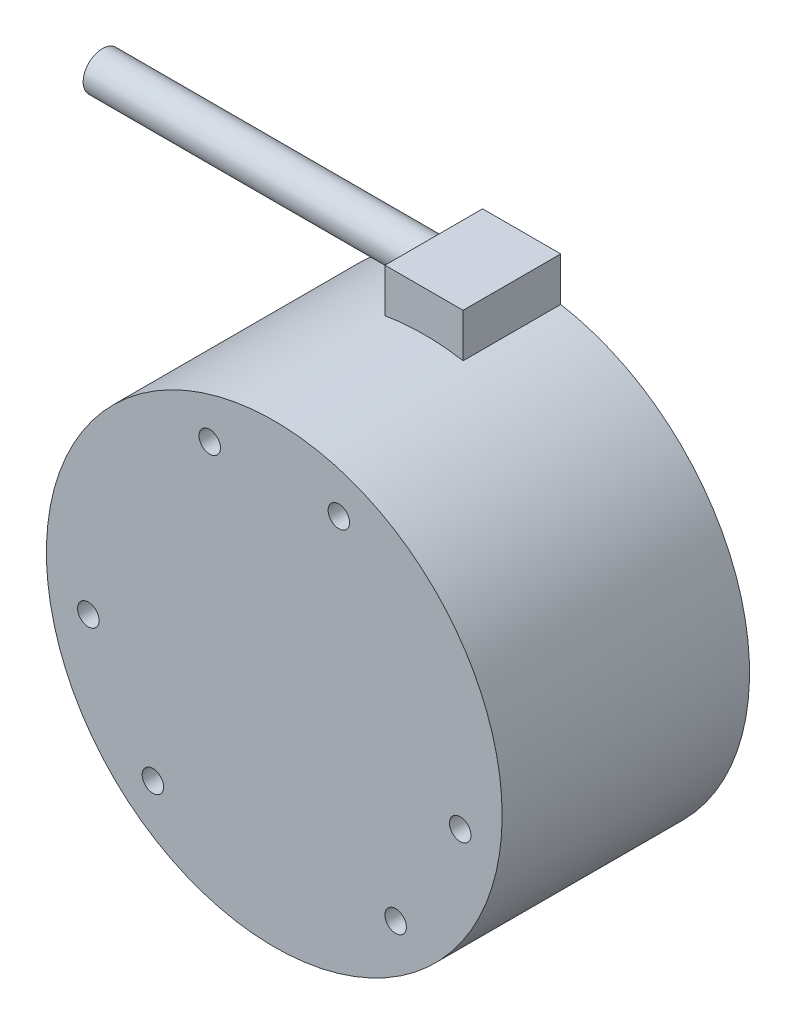
ISO-10303-21;
HEADER;
FILE_DESCRIPTION(('STEP AP214'),'2;1');
FILE_NAME('part.step','',(''),(''),'','','');
FILE_SCHEMA(('AUTOMOTIVE_DESIGN { 1 0 10303 214 1 1 1 1 }'));
ENDSEC;
DATA;
#1=APPLICATION_CONTEXT('core data for automotive mechanical design processes');
#2=APPLICATION_PROTOCOL_DEFINITION('international standard','automotive_design',2000,#1);
#3=PRODUCT_CONTEXT('',#1,'mechanical');
#4=PRODUCT('Part','Part','',(#3));
#5=PRODUCT_RELATED_PRODUCT_CATEGORY('part','',(#4));
#6=PRODUCT_DEFINITION_FORMATION('','',#4);
#7=PRODUCT_DEFINITION_CONTEXT('part definition',#1,'design');
#8=PRODUCT_DEFINITION('design','',#6,#7);
#9=PRODUCT_DEFINITION_SHAPE('','',#8);
#10=(LENGTH_UNIT() NAMED_UNIT(*) SI_UNIT(.MILLI.,.METRE.));
#11=(NAMED_UNIT(*) PLANE_ANGLE_UNIT() SI_UNIT($,.RADIAN.));
#12=(NAMED_UNIT(*) SI_UNIT($,.STERADIAN.) SOLID_ANGLE_UNIT());
#13=UNCERTAINTY_MEASURE_WITH_UNIT(LENGTH_MEASURE(1.E-05),#10,'distance_accuracy_value','');
#14=(GEOMETRIC_REPRESENTATION_CONTEXT(3) GLOBAL_UNCERTAINTY_ASSIGNED_CONTEXT((#13)) GLOBAL_UNIT_ASSIGNED_CONTEXT((#10,
#11,#12)) REPRESENTATION_CONTEXT('',''));
#15=CARTESIAN_POINT('',(0.,0.,0.));
#16=DIRECTION('',(0.,0.,1.));
#17=DIRECTION('',(1.,0.,0.));
#18=AXIS2_PLACEMENT_3D('',#15,#16,#17);
#19=CARTESIAN_POINT('',(0.,0.,38.));
#20=DIRECTION('',(0.,0.,-1.));
#21=DIRECTION('',(-1.,0.,0.));
#22=AXIS2_PLACEMENT_3D('',#19,#20,#21);
#23=CYLINDRICAL_SURFACE('',#22,35.);
#24=CARTESIAN_POINT('',(0.,0.,38.));
#25=DIRECTION('',(0.,0.,1.));
#26=DIRECTION('',(1.,0.,0.));
#27=AXIS2_PLACEMENT_3D('',#24,#25,#26);
#28=CIRCLE('',#27,35.);
#29=CARTESIAN_POINT('',(35.,0.,38.));
#30=VERTEX_POINT('',#29);
#31=EDGE_CURVE('E162',#30,#30,#28,.T.);
#32=ORIENTED_EDGE('',*,*,#31,.F.);
#33=EDGE_LOOP('',(#32));
#34=FACE_BOUND('',#33,.T.);
#35=CARTESIAN_POINT('',(0.,0.,15.));
#36=DIRECTION('',(0.,0.,1.));
#37=DIRECTION('',(1.,0.,0.));
#38=AXIS2_PLACEMENT_3D('',#35,#36,#37);
#39=CIRCLE('',#38,35.);
#40=CARTESIAN_POINT('',(6.,34.4818792991333,15.));
#41=VERTEX_POINT('',#40);
#42=CARTESIAN_POINT('',(-6.,34.4818792991333,15.));
#43=VERTEX_POINT('',#42);
#44=EDGE_CURVE('E36',#41,#43,#39,.T.);
#45=ORIENTED_EDGE('',*,*,#44,.T.);
#46=DIRECTION('',(0.,0.,-1.));
#47=VECTOR('',#46,1.);
#48=CARTESIAN_POINT('',(-6.,34.4818792991333,38.));
#49=LINE('',#48,#47);
#50=CARTESIAN_POINT('',(-6.,34.4818792991333,0.));
#51=VERTEX_POINT('',#50);
#52=EDGE_CURVE('E159',#43,#51,#49,.T.);
#53=ORIENTED_EDGE('',*,*,#52,.T.);
#54=CARTESIAN_POINT('',(0.,0.,0.));
#55=DIRECTION('',(0.,0.,1.));
#56=DIRECTION('',(1.,0.,0.));
#57=AXIS2_PLACEMENT_3D('',#54,#55,#56);
#58=CIRCLE('',#57,35.);
#59=CARTESIAN_POINT('',(6.,34.4818792991333,0.));
#60=VERTEX_POINT('',#59);
#61=EDGE_CURVE('E161',#51,#60,#58,.T.);
#62=ORIENTED_EDGE('',*,*,#61,.T.);
#63=DIRECTION('',(0.,0.,-1.));
#64=VECTOR('',#63,1.);
#65=CARTESIAN_POINT('',(6.,34.4818792991333,38.));
#66=LINE('',#65,#64);
#67=EDGE_CURVE('E151',#60,#41,#66,.F.);
#68=ORIENTED_EDGE('',*,*,#67,.T.);
#69=EDGE_LOOP('',(#45,#53,#62,#68));
#70=FACE_BOUND('',#69,.T.);
#71=ADVANCED_FACE('F33',(#34,#70),#23,.T.);
#72=CARTESIAN_POINT('',(0.,0.,38.));
#73=DIRECTION('',(0.,0.,1.));
#74=DIRECTION('',(1.,0.,0.));
#75=AXIS2_PLACEMENT_3D('',#72,#73,#74);
#76=PLANE('',#75);
#77=CARTESIAN_POINT('',(-9.91858415644441,27.2510860027913,38.));
#78=DIRECTION('',(0.,0.,1.));
#79=DIRECTION('',(1.,0.,0.));
#80=AXIS2_PLACEMENT_3D('',#77,#78,#79);
#81=CIRCLE('',#80,1.65);
#82=CARTESIAN_POINT('',(-8.26858415644442,27.2510860027913,38.));
#83=VERTEX_POINT('',#82);
#84=EDGE_CURVE('E101',#83,#83,#81,.T.);
#85=ORIENTED_EDGE('',*,*,#84,.F.);
#86=EDGE_LOOP('',(#85));
#87=FACE_BOUND('',#86,.T.);
#88=CARTESIAN_POINT('',(9.91858415644442,27.2510860027913,38.));
#89=DIRECTION('',(0.,0.,1.));
#90=DIRECTION('',(1.,0.,0.));
#91=AXIS2_PLACEMENT_3D('',#88,#89,#90);
#92=CIRCLE('',#91,1.65);
#93=CARTESIAN_POINT('',(11.5685841564444,27.2510860027913,38.));
#94=VERTEX_POINT('',#93);
#95=EDGE_CURVE('E100',#94,#94,#92,.T.);
#96=ORIENTED_EDGE('',*,*,#95,.F.);
#97=EDGE_LOOP('',(#96));
#98=FACE_BOUND('',#97,.T.);
#99=CARTESIAN_POINT('',(28.5594248373575,-5.03579715234037,38.));
#100=DIRECTION('',(0.,0.,1.));
#101=DIRECTION('',(1.,0.,0.));
#102=AXIS2_PLACEMENT_3D('',#99,#100,#101);
#103=CIRCLE('',#102,1.65);
#104=CARTESIAN_POINT('',(30.2094248373575,-5.03579715234037,38.));
#105=VERTEX_POINT('',#104);
#106=EDGE_CURVE('E111',#105,#105,#103,.T.);
#107=ORIENTED_EDGE('',*,*,#106,.F.);
#108=EDGE_LOOP('',(#107));
#109=FACE_BOUND('',#108,.T.);
#110=CARTESIAN_POINT('',(18.6408406809131,-22.2152888504498,38.));
#111=DIRECTION('',(0.,0.,1.));
#112=DIRECTION('',(1.,0.,0.));
#113=AXIS2_PLACEMENT_3D('',#110,#111,#112);
#114=CIRCLE('',#113,1.65);
#115=CARTESIAN_POINT('',(20.2908406809131,-22.2152888504498,38.));
#116=VERTEX_POINT('',#115);
#117=EDGE_CURVE('E117',#116,#116,#114,.T.);
#118=ORIENTED_EDGE('',*,*,#117,.F.);
#119=EDGE_LOOP('',(#118));
#120=FACE_BOUND('',#119,.T.);
#121=CARTESIAN_POINT('',(-18.6408406809074,-22.2152888504531,38.));
#122=DIRECTION('',(0.,0.,1.));
#123=DIRECTION('',(1.,0.,0.));
#124=AXIS2_PLACEMENT_3D('',#121,#122,#123);
#125=CIRCLE('',#124,1.65);
#126=CARTESIAN_POINT('',(-16.9908406809074,-22.2152888504531,38.));
#127=VERTEX_POINT('',#126);
#128=EDGE_CURVE('E123',#127,#127,#125,.T.);
#129=ORIENTED_EDGE('',*,*,#128,.F.);
#130=EDGE_LOOP('',(#129));
#131=FACE_BOUND('',#130,.T.);
#132=CARTESIAN_POINT('',(-28.5594248373518,-5.03579715234368,38.));
#133=DIRECTION('',(0.,0.,1.));
#134=DIRECTION('',(1.,0.,0.));
#135=AXIS2_PLACEMENT_3D('',#132,#133,#134);
#136=CIRCLE('',#135,1.65);
#137=CARTESIAN_POINT('',(-26.9094248373518,-5.03579715234368,38.));
#138=VERTEX_POINT('',#137);
#139=EDGE_CURVE('E129',#138,#138,#136,.T.);
#140=ORIENTED_EDGE('',*,*,#139,.F.);
#141=EDGE_LOOP('',(#140));
#142=FACE_BOUND('',#141,.T.);
#143=ORIENTED_EDGE('',*,*,#31,.T.);
#144=EDGE_LOOP('',(#143));
#145=FACE_BOUND('',#144,.T.);
#146=ADVANCED_FACE('F191',(#87,#98,#109,#120,#131,#142,#145),#76,.T.);
#147=CARTESIAN_POINT('',(0.,0.,0.));
#148=DIRECTION('',(0.,0.,1.));
#149=DIRECTION('',(1.,0.,0.));
#150=AXIS2_PLACEMENT_3D('',#147,#148,#149);
#151=PLANE('',#150);
#152=ORIENTED_EDGE('',*,*,#61,.F.);
#153=DIRECTION('',(0.,1.,0.));
#154=VECTOR('',#153,1.);
#155=CARTESIAN_POINT('',(-6.,30.2,0.));
#156=LINE('',#155,#154);
#157=CARTESIAN_POINT('',(-6.,41.2,0.));
#158=VERTEX_POINT('',#157);
#159=EDGE_CURVE('E55',#51,#158,#156,.T.);
#160=ORIENTED_EDGE('',*,*,#159,.T.);
#161=DIRECTION('',(-1.,0.,0.));
#162=VECTOR('',#161,1.);
#163=CARTESIAN_POINT('',(-6.,41.2,0.));
#164=LINE('',#163,#162);
#165=CARTESIAN_POINT('',(6.,41.2,0.));
#166=VERTEX_POINT('',#165);
#167=EDGE_CURVE('E147',#166,#158,#164,.T.);
#168=ORIENTED_EDGE('',*,*,#167,.F.);
#169=DIRECTION('',(0.,1.,0.));
#170=VECTOR('',#169,1.);
#171=CARTESIAN_POINT('',(6.,30.2,0.));
#172=LINE('',#171,#170);
#173=EDGE_CURVE('E152',#60,#166,#172,.T.);
#174=ORIENTED_EDGE('',*,*,#173,.F.);
#175=EDGE_LOOP('',(#152,#160,#168,#174));
#176=FACE_BOUND('',#175,.T.);
#177=ADVANCED_FACE('F170',(#176),#151,.F.);
#178=CARTESIAN_POINT('',(-6.,30.2,0.));
#179=DIRECTION('',(-1.,0.,0.));
#180=DIRECTION('',(0.,0.,1.));
#181=AXIS2_PLACEMENT_3D('',#178,#179,#180);
#182=PLANE('',#181);
#183=CARTESIAN_POINT('',(-6.,37.7608934756785,7.40588586129198));
#184=DIRECTION('',(-1.,0.,0.));
#185=DIRECTION('',(0.,0.,1.));
#186=AXIS2_PLACEMENT_3D('',#183,#184,#185);
#187=CIRCLE('',#186,2.95);
#188=CARTESIAN_POINT('',(-6.,37.7608934756785,10.355885861292));
#189=VERTEX_POINT('',#188);
#190=EDGE_CURVE('E11',#189,#189,#187,.T.);
#191=ORIENTED_EDGE('',*,*,#190,.F.);
#192=EDGE_LOOP('',(#191));
#193=FACE_BOUND('',#192,.T.);
#194=ORIENTED_EDGE('',*,*,#52,.F.);
#195=DIRECTION('',(0.,1.,0.));
#196=VECTOR('',#195,1.);
#197=CARTESIAN_POINT('',(-6.,30.2,15.));
#198=LINE('',#197,#196);
#199=CARTESIAN_POINT('',(-6.,41.2,15.));
#200=VERTEX_POINT('',#199);
#201=EDGE_CURVE('E48',#43,#200,#198,.T.);
#202=ORIENTED_EDGE('',*,*,#201,.T.);
#203=DIRECTION('',(0.,0.,1.));
#204=VECTOR('',#203,1.);
#205=CARTESIAN_POINT('',(-6.,41.2,0.));
#206=LINE('',#205,#204);
#207=EDGE_CURVE('E137',#158,#200,#206,.T.);
#208=ORIENTED_EDGE('',*,*,#207,.F.);
#209=ORIENTED_EDGE('',*,*,#159,.F.);
#210=EDGE_LOOP('',(#194,#202,#208,#209));
#211=FACE_BOUND('',#210,.T.);
#212=ADVANCED_FACE('F187',(#193,#211),#182,.T.);
#213=CARTESIAN_POINT('',(6.,30.2,0.));
#214=DIRECTION('',(1.,0.,0.));
#215=DIRECTION('',(0.,0.,-1.));
#216=AXIS2_PLACEMENT_3D('',#213,#214,#215);
#217=PLANE('',#216);
#218=ORIENTED_EDGE('',*,*,#67,.F.);
#219=ORIENTED_EDGE('',*,*,#173,.T.);
#220=DIRECTION('',(0.,0.,-1.));
#221=VECTOR('',#220,1.);
#222=CARTESIAN_POINT('',(6.,41.2,0.));
#223=LINE('',#222,#221);
#224=CARTESIAN_POINT('',(6.,41.2,15.));
#225=VERTEX_POINT('',#224);
#226=EDGE_CURVE('E144',#225,#166,#223,.T.);
#227=ORIENTED_EDGE('',*,*,#226,.F.);
#228=DIRECTION('',(0.,1.,0.));
#229=VECTOR('',#228,1.);
#230=CARTESIAN_POINT('',(6.,30.2,15.));
#231=LINE('',#230,#229);
#232=EDGE_CURVE('E154',#41,#225,#231,.T.);
#233=ORIENTED_EDGE('',*,*,#232,.F.);
#234=EDGE_LOOP('',(#218,#219,#227,#233));
#235=FACE_BOUND('',#234,.T.);
#236=ADVANCED_FACE('F174',(#235),#217,.T.);
#237=CARTESIAN_POINT('',(-6.,30.2,15.));
#238=DIRECTION('',(0.,0.,1.));
#239=DIRECTION('',(1.,0.,0.));
#240=AXIS2_PLACEMENT_3D('',#237,#238,#239);
#241=PLANE('',#240);
#242=ORIENTED_EDGE('',*,*,#44,.F.);
#243=ORIENTED_EDGE('',*,*,#232,.T.);
#244=DIRECTION('',(1.,0.,0.));
#245=VECTOR('',#244,1.);
#246=CARTESIAN_POINT('',(-6.,41.2,15.));
#247=LINE('',#246,#245);
#248=EDGE_CURVE('E141',#200,#225,#247,.T.);
#249=ORIENTED_EDGE('',*,*,#248,.F.);
#250=ORIENTED_EDGE('',*,*,#201,.F.);
#251=EDGE_LOOP('',(#242,#243,#249,#250));
#252=FACE_BOUND('',#251,.T.);
#253=ADVANCED_FACE('F178',(#252),#241,.T.);
#254=CARTESIAN_POINT('',(0.,41.2,0.));
#255=DIRECTION('',(0.,1.,0.));
#256=DIRECTION('',(0.,0.,1.));
#257=AXIS2_PLACEMENT_3D('',#254,#255,#256);
#258=PLANE('',#257);
#259=ORIENTED_EDGE('',*,*,#207,.T.);
#260=ORIENTED_EDGE('',*,*,#248,.T.);
#261=ORIENTED_EDGE('',*,*,#226,.T.);
#262=ORIENTED_EDGE('',*,*,#167,.T.);
#263=EDGE_LOOP('',(#259,#260,#261,#262));
#264=FACE_BOUND('',#263,.T.);
#265=ADVANCED_FACE('F177',(#264),#258,.T.);
#266=CARTESIAN_POINT('',(-57.,37.7608934756785,7.40588586129199));
#267=DIRECTION('',(1.,0.,0.));
#268=DIRECTION('',(0.,0.,-1.));
#269=AXIS2_PLACEMENT_3D('',#266,#267,#268);
#270=CYLINDRICAL_SURFACE('',#269,2.95);
#271=ORIENTED_EDGE('',*,*,#190,.T.);
#272=EDGE_LOOP('',(#271));
#273=FACE_BOUND('',#272,.T.);
#274=CARTESIAN_POINT('',(-57.,37.7608934756785,7.40588586129199));
#275=DIRECTION('',(1.,0.,0.));
#276=DIRECTION('',(0.,0.,-1.));
#277=AXIS2_PLACEMENT_3D('',#274,#275,#276);
#278=CIRCLE('',#277,2.95);
#279=CARTESIAN_POINT('',(-57.,37.7608934756785,4.45588586129199));
#280=VERTEX_POINT('',#279);
#281=EDGE_CURVE('E135',#280,#280,#278,.T.);
#282=ORIENTED_EDGE('',*,*,#281,.T.);
#283=EDGE_LOOP('',(#282));
#284=FACE_BOUND('',#283,.T.);
#285=ADVANCED_FACE('F185',(#273,#284),#270,.T.);
#286=CARTESIAN_POINT('',(-57.,37.7608934756785,7.40588586129199));
#287=DIRECTION('',(1.,0.,0.));
#288=DIRECTION('',(0.,0.,-1.));
#289=AXIS2_PLACEMENT_3D('',#286,#287,#288);
#290=PLANE('',#289);
#291=ORIENTED_EDGE('',*,*,#281,.F.);
#292=EDGE_LOOP('',(#291));
#293=FACE_BOUND('',#292,.T.);
#294=ADVANCED_FACE('F213',(#293),#290,.F.);
#295=CARTESIAN_POINT('',(-28.5594248373518,-5.03579715234368,33.));
#296=DIRECTION('',(0.,0.,1.));
#297=DIRECTION('',(1.,0.,0.));
#298=AXIS2_PLACEMENT_3D('',#295,#296,#297);
#299=CONICAL_SURFACE('',#298,1.65,1.02974425867665);
#300=CARTESIAN_POINT('',(-28.5594248373518,-5.03579715234368,32.0085799786045));
#301=VERTEX_POINT('',#300);
#302=VERTEX_LOOP('',#301);
#303=FACE_BOUND('',#302,.T.);
#304=CARTESIAN_POINT('',(-28.5594248373518,-5.03579715234368,33.));
#305=DIRECTION('',(0.,0.,1.));
#306=DIRECTION('',(1.,0.,0.));
#307=AXIS2_PLACEMENT_3D('',#304,#305,#306);
#308=CIRCLE('',#307,1.65);
#309=CARTESIAN_POINT('',(-26.9094248373518,-5.03579715234368,33.));
#310=VERTEX_POINT('',#309);
#311=EDGE_CURVE('E132',#310,#310,#308,.T.);
#312=ORIENTED_EDGE('',*,*,#311,.T.);
#313=EDGE_LOOP('',(#312));
#314=FACE_BOUND('',#313,.T.);
#315=ADVANCED_FACE('F218',(#303,#314),#299,.F.);
#316=CARTESIAN_POINT('',(-28.5594248373518,-5.03579715234368,38.));
#317=DIRECTION('',(0.,0.,1.));
#318=DIRECTION('',(1.,0.,0.));
#319=AXIS2_PLACEMENT_3D('',#316,#317,#318);
#320=CYLINDRICAL_SURFACE('',#319,1.65);
#321=ORIENTED_EDGE('',*,*,#311,.F.);
#322=EDGE_LOOP('',(#321));
#323=FACE_BOUND('',#322,.T.);
#324=ORIENTED_EDGE('',*,*,#139,.T.);
#325=EDGE_LOOP('',(#324));
#326=FACE_BOUND('',#325,.T.);
#327=ADVANCED_FACE('F223',(#323,#326),#320,.F.);
#328=CARTESIAN_POINT('',(-18.6408406809074,-22.2152888504531,33.));
#329=DIRECTION('',(0.,0.,1.));
#330=DIRECTION('',(1.,0.,0.));
#331=AXIS2_PLACEMENT_3D('',#328,#329,#330);
#332=CONICAL_SURFACE('',#331,1.65,1.02974425867665);
#333=CARTESIAN_POINT('',(-18.6408406809074,-22.2152888504531,32.0085799786045));
#334=VERTEX_POINT('',#333);
#335=VERTEX_LOOP('',#334);
#336=FACE_BOUND('',#335,.T.);
#337=CARTESIAN_POINT('',(-18.6408406809074,-22.2152888504531,33.));
#338=DIRECTION('',(0.,0.,1.));
#339=DIRECTION('',(1.,0.,0.));
#340=AXIS2_PLACEMENT_3D('',#337,#338,#339);
#341=CIRCLE('',#340,1.65);
#342=CARTESIAN_POINT('',(-16.9908406809074,-22.2152888504531,33.));
#343=VERTEX_POINT('',#342);
#344=EDGE_CURVE('E126',#343,#343,#341,.T.);
#345=ORIENTED_EDGE('',*,*,#344,.T.);
#346=EDGE_LOOP('',(#345));
#347=FACE_BOUND('',#346,.T.);
#348=ADVANCED_FACE('F229',(#336,#347),#332,.F.);
#349=CARTESIAN_POINT('',(-18.6408406809074,-22.2152888504531,38.));
#350=DIRECTION('',(0.,0.,1.));
#351=DIRECTION('',(1.,0.,0.));
#352=AXIS2_PLACEMENT_3D('',#349,#350,#351);
#353=CYLINDRICAL_SURFACE('',#352,1.65);
#354=ORIENTED_EDGE('',*,*,#344,.F.);
#355=EDGE_LOOP('',(#354));
#356=FACE_BOUND('',#355,.T.);
#357=ORIENTED_EDGE('',*,*,#128,.T.);
#358=EDGE_LOOP('',(#357));
#359=FACE_BOUND('',#358,.T.);
#360=ADVANCED_FACE('F233',(#356,#359),#353,.F.);
#361=CARTESIAN_POINT('',(18.6408406809131,-22.2152888504498,33.));
#362=DIRECTION('',(0.,0.,1.));
#363=DIRECTION('',(1.,0.,0.));
#364=AXIS2_PLACEMENT_3D('',#361,#362,#363);
#365=CONICAL_SURFACE('',#364,1.65,1.02974425867665);
#366=CARTESIAN_POINT('',(18.6408406809131,-22.2152888504498,32.0085799786045));
#367=VERTEX_POINT('',#366);
#368=VERTEX_LOOP('',#367);
#369=FACE_BOUND('',#368,.T.);
#370=CARTESIAN_POINT('',(18.6408406809131,-22.2152888504498,33.));
#371=DIRECTION('',(0.,0.,1.));
#372=DIRECTION('',(1.,0.,0.));
#373=AXIS2_PLACEMENT_3D('',#370,#371,#372);
#374=CIRCLE('',#373,1.65);
#375=CARTESIAN_POINT('',(20.2908406809131,-22.2152888504498,33.));
#376=VERTEX_POINT('',#375);
#377=EDGE_CURVE('E120',#376,#376,#374,.T.);
#378=ORIENTED_EDGE('',*,*,#377,.T.);
#379=EDGE_LOOP('',(#378));
#380=FACE_BOUND('',#379,.T.);
#381=ADVANCED_FACE('F237',(#369,#380),#365,.F.);
#382=CARTESIAN_POINT('',(18.6408406809131,-22.2152888504498,38.));
#383=DIRECTION('',(0.,0.,1.));
#384=DIRECTION('',(1.,0.,0.));
#385=AXIS2_PLACEMENT_3D('',#382,#383,#384);
#386=CYLINDRICAL_SURFACE('',#385,1.65);
#387=ORIENTED_EDGE('',*,*,#377,.F.);
#388=EDGE_LOOP('',(#387));
#389=FACE_BOUND('',#388,.T.);
#390=ORIENTED_EDGE('',*,*,#117,.T.);
#391=EDGE_LOOP('',(#390));
#392=FACE_BOUND('',#391,.T.);
#393=ADVANCED_FACE('F241',(#389,#392),#386,.F.);
#394=CARTESIAN_POINT('',(28.5594248373575,-5.03579715234037,33.));
#395=DIRECTION('',(0.,0.,1.));
#396=DIRECTION('',(1.,0.,0.));
#397=AXIS2_PLACEMENT_3D('',#394,#395,#396);
#398=CONICAL_SURFACE('',#397,1.65,1.02974425867665);
#399=CARTESIAN_POINT('',(28.5594248373575,-5.03579715234037,32.0085799786045));
#400=VERTEX_POINT('',#399);
#401=VERTEX_LOOP('',#400);
#402=FACE_BOUND('',#401,.T.);
#403=CARTESIAN_POINT('',(28.5594248373575,-5.03579715234037,33.));
#404=DIRECTION('',(0.,0.,1.));
#405=DIRECTION('',(1.,0.,0.));
#406=AXIS2_PLACEMENT_3D('',#403,#404,#405);
#407=CIRCLE('',#406,1.65);
#408=CARTESIAN_POINT('',(30.2094248373575,-5.03579715234037,33.));
#409=VERTEX_POINT('',#408);
#410=EDGE_CURVE('E114',#409,#409,#407,.T.);
#411=ORIENTED_EDGE('',*,*,#410,.T.);
#412=EDGE_LOOP('',(#411));
#413=FACE_BOUND('',#412,.T.);
#414=ADVANCED_FACE('F245',(#402,#413),#398,.F.);
#415=CARTESIAN_POINT('',(28.5594248373575,-5.03579715234037,38.));
#416=DIRECTION('',(0.,0.,1.));
#417=DIRECTION('',(1.,0.,0.));
#418=AXIS2_PLACEMENT_3D('',#415,#416,#417);
#419=CYLINDRICAL_SURFACE('',#418,1.65);
#420=ORIENTED_EDGE('',*,*,#410,.F.);
#421=EDGE_LOOP('',(#420));
#422=FACE_BOUND('',#421,.T.);
#423=ORIENTED_EDGE('',*,*,#106,.T.);
#424=EDGE_LOOP('',(#423));
#425=FACE_BOUND('',#424,.T.);
#426=ADVANCED_FACE('F249',(#422,#425),#419,.F.);
#427=CARTESIAN_POINT('',(9.91858415644442,27.2510860027913,33.));
#428=DIRECTION('',(0.,0.,1.));
#429=DIRECTION('',(1.,0.,0.));
#430=AXIS2_PLACEMENT_3D('',#427,#428,#429);
#431=CONICAL_SURFACE('',#430,1.65,1.02974425867665);
#432=CARTESIAN_POINT('',(9.91858415644441,27.2510860027913,32.0085799786045));
#433=VERTEX_POINT('',#432);
#434=VERTEX_LOOP('',#433);
#435=FACE_BOUND('',#434,.T.);
#436=CARTESIAN_POINT('',(9.91858415644442,27.2510860027913,33.));
#437=DIRECTION('',(0.,0.,1.));
#438=DIRECTION('',(1.,0.,0.));
#439=AXIS2_PLACEMENT_3D('',#436,#437,#438);
#440=CIRCLE('',#439,1.65);
#441=CARTESIAN_POINT('',(11.5685841564444,27.2510860027913,33.));
#442=VERTEX_POINT('',#441);
#443=EDGE_CURVE('E104',#442,#442,#440,.T.);
#444=ORIENTED_EDGE('',*,*,#443,.T.);
#445=EDGE_LOOP('',(#444));
#446=FACE_BOUND('',#445,.T.);
#447=ADVANCED_FACE('F253',(#435,#446),#431,.F.);
#448=CARTESIAN_POINT('',(9.91858415644442,27.2510860027913,38.));
#449=DIRECTION('',(0.,0.,1.));
#450=DIRECTION('',(1.,0.,0.));
#451=AXIS2_PLACEMENT_3D('',#448,#449,#450);
#452=CYLINDRICAL_SURFACE('',#451,1.65);
#453=ORIENTED_EDGE('',*,*,#443,.F.);
#454=EDGE_LOOP('',(#453));
#455=FACE_BOUND('',#454,.T.);
#456=ORIENTED_EDGE('',*,*,#95,.T.);
#457=EDGE_LOOP('',(#456));
#458=FACE_BOUND('',#457,.T.);
#459=ADVANCED_FACE('F94',(#455,#458),#452,.F.);
#460=CARTESIAN_POINT('',(-9.91858415644441,27.2510860027913,33.));
#461=DIRECTION('',(0.,0.,1.));
#462=DIRECTION('',(1.,0.,0.));
#463=AXIS2_PLACEMENT_3D('',#460,#461,#462);
#464=CONICAL_SURFACE('',#463,1.65,1.02974425867665);
#465=CARTESIAN_POINT('',(-9.91858415644442,27.2510860027913,32.0085799786045));
#466=VERTEX_POINT('',#465);
#467=VERTEX_LOOP('',#466);
#468=FACE_BOUND('',#467,.T.);
#469=CARTESIAN_POINT('',(-9.91858415644441,27.2510860027913,33.));
#470=DIRECTION('',(0.,0.,1.));
#471=DIRECTION('',(1.,0.,0.));
#472=AXIS2_PLACEMENT_3D('',#469,#470,#471);
#473=CIRCLE('',#472,1.65);
#474=CARTESIAN_POINT('',(-8.26858415644442,27.2510860027913,33.));
#475=VERTEX_POINT('',#474);
#476=EDGE_CURVE('E98',#475,#475,#473,.T.);
#477=ORIENTED_EDGE('',*,*,#476,.T.);
#478=EDGE_LOOP('',(#477));
#479=FACE_BOUND('',#478,.T.);
#480=ADVANCED_FACE('F90',(#468,#479),#464,.F.);
#481=CARTESIAN_POINT('',(-9.91858415644441,27.2510860027913,38.));
#482=DIRECTION('',(0.,0.,1.));
#483=DIRECTION('',(1.,0.,0.));
#484=AXIS2_PLACEMENT_3D('',#481,#482,#483);
#485=CYLINDRICAL_SURFACE('',#484,1.65);
#486=ORIENTED_EDGE('',*,*,#476,.F.);
#487=EDGE_LOOP('',(#486));
#488=FACE_BOUND('',#487,.T.);
#489=ORIENTED_EDGE('',*,*,#84,.T.);
#490=EDGE_LOOP('',(#489));
#491=FACE_BOUND('',#490,.T.);
#492=ADVANCED_FACE('F93',(#488,#491),#485,.F.);
#493=CLOSED_SHELL('',(#71,#146,#177,#212,#236,#253,#265,#285,#294,#315,#327,#348,#360,#381,#393,
#414,#426,#447,#459,#480,#492));
#494=MANIFOLD_SOLID_BREP('B2',#493);
#495=ADVANCED_BREP_SHAPE_REPRESENTATION('',(#18,#494),#14);
#496=SHAPE_DEFINITION_REPRESENTATION(#9,#495);
ENDSEC;
END-ISO-10303-21;
